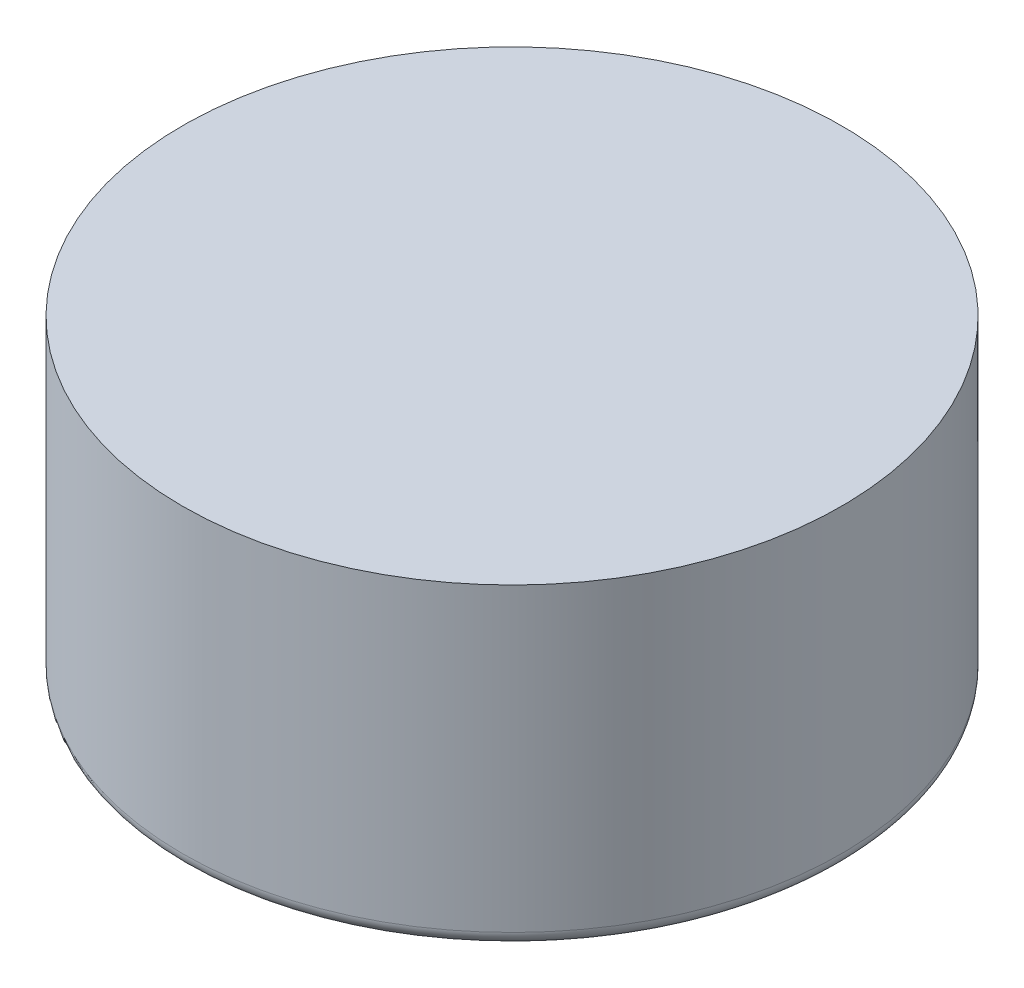
ISO-10303-21;
HEADER;
FILE_DESCRIPTION(('STEP AP214'),'2;1');
FILE_NAME('part.step','',(''),(''),'','','');
FILE_SCHEMA(('AUTOMOTIVE_DESIGN { 1 0 10303 214 1 1 1 1 }'));
ENDSEC;
DATA;
#1=APPLICATION_CONTEXT('core data for automotive mechanical design processes');
#2=APPLICATION_PROTOCOL_DEFINITION('international standard','automotive_design',2000,#1);
#3=PRODUCT_CONTEXT('',#1,'mechanical');
#4=PRODUCT('Part','Part','',(#3));
#5=PRODUCT_RELATED_PRODUCT_CATEGORY('part','',(#4));
#6=PRODUCT_DEFINITION_FORMATION('','',#4);
#7=PRODUCT_DEFINITION_CONTEXT('part definition',#1,'design');
#8=PRODUCT_DEFINITION('design','',#6,#7);
#9=PRODUCT_DEFINITION_SHAPE('','',#8);
#10=(LENGTH_UNIT() NAMED_UNIT(*) SI_UNIT(.MILLI.,.METRE.));
#11=(NAMED_UNIT(*) PLANE_ANGLE_UNIT() SI_UNIT($,.RADIAN.));
#12=(NAMED_UNIT(*) SI_UNIT($,.STERADIAN.) SOLID_ANGLE_UNIT());
#13=UNCERTAINTY_MEASURE_WITH_UNIT(LENGTH_MEASURE(1.E-05),#10,'distance_accuracy_value','');
#14=(GEOMETRIC_REPRESENTATION_CONTEXT(3) GLOBAL_UNCERTAINTY_ASSIGNED_CONTEXT((#13)) GLOBAL_UNIT_ASSIGNED_CONTEXT((#10,
#11,#12)) REPRESENTATION_CONTEXT('',''));
#15=CARTESIAN_POINT('',(0.,0.,0.));
#16=DIRECTION('',(0.,0.,1.));
#17=DIRECTION('',(1.,0.,0.));
#18=AXIS2_PLACEMENT_3D('',#15,#16,#17);
#19=CARTESIAN_POINT('',(0.,5.5,0.));
#20=DIRECTION('',(0.,-1.,0.));
#21=DIRECTION('',(0.,0.,-1.));
#22=AXIS2_PLACEMENT_3D('',#19,#20,#21);
#23=CYLINDRICAL_SURFACE('',#22,11.5);
#24=CARTESIAN_POINT('',(0.,-5.,0.));
#25=DIRECTION('',(0.,1.,0.));
#26=DIRECTION('',(0.,0.,1.));
#27=AXIS2_PLACEMENT_3D('',#24,#25,#26);
#28=CIRCLE('',#27,11.5);
#29=CARTESIAN_POINT('',(0.,-5.,11.5));
#30=VERTEX_POINT('',#29);
#31=EDGE_CURVE('E51',#30,#30,#28,.T.);
#32=ORIENTED_EDGE('',*,*,#31,.T.);
#33=EDGE_LOOP('',(#32));
#34=FACE_BOUND('',#33,.T.);
#35=CARTESIAN_POINT('',(0.,5.5,0.));
#36=DIRECTION('',(0.,1.,0.));
#37=DIRECTION('',(0.,0.,1.));
#38=AXIS2_PLACEMENT_3D('',#35,#36,#37);
#39=CIRCLE('',#38,11.5);
#40=CARTESIAN_POINT('',(0.,5.5,11.5));
#41=VERTEX_POINT('',#40);
#42=EDGE_CURVE('E61',#41,#41,#39,.T.);
#43=ORIENTED_EDGE('',*,*,#42,.F.);
#44=EDGE_LOOP('',(#43));
#45=FACE_BOUND('',#44,.T.);
#46=ADVANCED_FACE('F43',(#34,#45),#23,.T.);
#47=CARTESIAN_POINT('',(0.,5.5,0.));
#48=DIRECTION('',(0.,1.,0.));
#49=DIRECTION('',(0.,0.,1.));
#50=AXIS2_PLACEMENT_3D('',#47,#48,#49);
#51=PLANE('',#50);
#52=ORIENTED_EDGE('',*,*,#42,.T.);
#53=EDGE_LOOP('',(#52));
#54=FACE_BOUND('',#53,.T.);
#55=ADVANCED_FACE('F84',(#54),#51,.T.);
#56=CARTESIAN_POINT('',(0.,-5.5,0.));
#57=DIRECTION('',(0.,1.,0.));
#58=DIRECTION('',(0.,0.,1.));
#59=AXIS2_PLACEMENT_3D('',#56,#57,#58);
#60=PLANE('',#59);
#61=CARTESIAN_POINT('',(0.,-5.5,0.));
#62=DIRECTION('',(0.,1.,0.));
#63=DIRECTION('',(0.,0.,1.));
#64=AXIS2_PLACEMENT_3D('',#61,#62,#63);
#65=CIRCLE('',#64,11.);
#66=CARTESIAN_POINT('',(0.,-5.5,11.));
#67=VERTEX_POINT('',#66);
#68=EDGE_CURVE('E10',#67,#67,#65,.F.);
#69=ORIENTED_EDGE('',*,*,#68,.T.);
#70=EDGE_LOOP('',(#69));
#71=FACE_BOUND('',#70,.T.);
#72=CARTESIAN_POINT('',(0.,-5.5,0.));
#73=DIRECTION('',(0.,1.,0.));
#74=DIRECTION('',(0.,0.,1.));
#75=AXIS2_PLACEMENT_3D('',#72,#73,#74);
#76=CIRCLE('',#75,1.);
#77=CARTESIAN_POINT('',(0.,-5.5,1.));
#78=VERTEX_POINT('',#77);
#79=EDGE_CURVE('E57',#78,#78,#76,.F.);
#80=ORIENTED_EDGE('',*,*,#79,.F.);
#81=EDGE_LOOP('',(#80));
#82=FACE_BOUND('',#81,.T.);
#83=ADVANCED_FACE('F80',(#71,#82),#60,.F.);
#84=CARTESIAN_POINT('',(0.,-8.75,0.));
#85=DIRECTION('',(0.,1.,0.));
#86=DIRECTION('',(0.,0.,1.));
#87=AXIS2_PLACEMENT_3D('',#84,#85,#86);
#88=CYLINDRICAL_SURFACE('',#87,1.);
#89=CARTESIAN_POINT('',(0.,-8.75,0.));
#90=DIRECTION('',(0.,-1.,0.));
#91=DIRECTION('',(0.,0.,-1.));
#92=AXIS2_PLACEMENT_3D('',#89,#90,#91);
#93=CIRCLE('',#92,1.);
#94=CARTESIAN_POINT('',(0.,-8.75,1.));
#95=VERTEX_POINT('',#94);
#96=EDGE_CURVE('E69',#95,#95,#93,.T.);
#97=CARTESIAN_POINT('',(0.,-8.75,1.));
#98=CARTESIAN_POINT('',(0.,-8.71614583333333,1.));
#99=CARTESIAN_POINT('',(0.,-8.68229166666666,1.));
#100=CARTESIAN_POINT('',(0.,-8.61458333333333,1.));
#101=CARTESIAN_POINT('',(0.,-8.58072916666667,1.));
#102=CARTESIAN_POINT('',(0.,-8.51302083333333,1.));
#103=CARTESIAN_POINT('',(0.,-8.47916666666666,1.));
#104=CARTESIAN_POINT('',(0.,-8.41145833333333,1.));
#105=CARTESIAN_POINT('',(0.,-8.37760416666666,1.));
#106=CARTESIAN_POINT('',(0.,-8.30989583333333,1.));
#107=CARTESIAN_POINT('',(0.,-8.27604166666666,1.));
#108=CARTESIAN_POINT('',(0.,-8.20833333333333,1.));
#109=CARTESIAN_POINT('',(0.,-8.17447916666666,1.));
#110=CARTESIAN_POINT('',(0.,-8.10677083333333,1.));
#111=CARTESIAN_POINT('',(0.,-8.07291666666667,1.));
#112=CARTESIAN_POINT('',(0.,-8.00520833333333,1.));
#113=CARTESIAN_POINT('',(0.,-7.97135416666667,1.));
#114=CARTESIAN_POINT('',(0.,-7.90364583333333,1.));
#115=CARTESIAN_POINT('',(0.,-7.86979166666667,1.));
#116=CARTESIAN_POINT('',(0.,-7.80208333333333,1.));
#117=CARTESIAN_POINT('',(0.,-7.76822916666667,1.));
#118=CARTESIAN_POINT('',(0.,-7.70052083333333,1.));
#119=CARTESIAN_POINT('',(0.,-7.66666666666667,1.));
#120=CARTESIAN_POINT('',(0.,-7.59895833333333,1.));
#121=CARTESIAN_POINT('',(0.,-7.56510416666667,1.));
#122=CARTESIAN_POINT('',(0.,-7.49739583333333,1.));
#123=CARTESIAN_POINT('',(0.,-7.46354166666667,1.));
#124=CARTESIAN_POINT('',(0.,-7.39583333333333,1.));
#125=CARTESIAN_POINT('',(0.,-7.36197916666667,1.));
#126=CARTESIAN_POINT('',(0.,-7.29427083333333,1.));
#127=CARTESIAN_POINT('',(0.,-7.26041666666667,1.));
#128=CARTESIAN_POINT('',(0.,-7.19270833333333,1.));
#129=CARTESIAN_POINT('',(0.,-7.15885416666667,1.));
#130=CARTESIAN_POINT('',(0.,-7.09114583333333,1.));
#131=CARTESIAN_POINT('',(0.,-7.05729166666667,1.));
#132=CARTESIAN_POINT('',(0.,-6.98958333333333,1.));
#133=CARTESIAN_POINT('',(0.,-6.95572916666667,1.));
#134=CARTESIAN_POINT('',(0.,-6.88802083333333,1.));
#135=CARTESIAN_POINT('',(0.,-6.85416666666667,1.));
#136=CARTESIAN_POINT('',(0.,-6.78645833333333,1.));
#137=CARTESIAN_POINT('',(0.,-6.75260416666667,1.));
#138=CARTESIAN_POINT('',(0.,-6.68489583333333,1.));
#139=CARTESIAN_POINT('',(0.,-6.65104166666667,1.));
#140=CARTESIAN_POINT('',(0.,-6.58333333333333,1.));
#141=CARTESIAN_POINT('',(0.,-6.54947916666667,1.));
#142=CARTESIAN_POINT('',(0.,-6.48177083333333,1.));
#143=CARTESIAN_POINT('',(0.,-6.44791666666667,1.));
#144=CARTESIAN_POINT('',(0.,-6.38020833333333,1.));
#145=CARTESIAN_POINT('',(0.,-6.34635416666667,1.));
#146=CARTESIAN_POINT('',(0.,-6.27864583333333,1.));
#147=CARTESIAN_POINT('',(0.,-6.24479166666667,1.));
#148=CARTESIAN_POINT('',(0.,-6.17708333333333,1.));
#149=CARTESIAN_POINT('',(0.,-6.14322916666667,1.));
#150=CARTESIAN_POINT('',(0.,-6.07552083333333,1.));
#151=CARTESIAN_POINT('',(0.,-6.04166666666667,1.));
#152=CARTESIAN_POINT('',(0.,-5.97395833333333,1.));
#153=CARTESIAN_POINT('',(0.,-5.94010416666667,1.));
#154=CARTESIAN_POINT('',(0.,-5.87239583333333,1.));
#155=CARTESIAN_POINT('',(0.,-5.83854166666667,1.));
#156=CARTESIAN_POINT('',(0.,-5.77083333333333,1.));
#157=CARTESIAN_POINT('',(0.,-5.73697916666667,1.));
#158=CARTESIAN_POINT('',(0.,-5.66927083333333,1.));
#159=CARTESIAN_POINT('',(0.,-5.63541666666667,1.));
#160=CARTESIAN_POINT('',(0.,-5.56770833333333,1.));
#161=CARTESIAN_POINT('',(0.,-5.53385416666667,1.));
#162=CARTESIAN_POINT('',(0.,-5.5,1.));
#163=B_SPLINE_CURVE_WITH_KNOTS('',3,(#97,#98,#99,#100,#101,#102,#103,#104,#105,#106,#107,#108,
#109,#110,#111,#112,#113,#114,#115,#116,#117,#118,#119,#120,#121,#122,#123,#124,#125,#126,#127,
#128,#129,#130,#131,#132,#133,#134,#135,#136,#137,#138,#139,#140,#141,#142,#143,#144,#145,#146,
#147,#148,#149,#150,#151,#152,#153,#154,#155,#156,#157,#158,#159,#160,#161,#162),.UNSPECIFIED.,
.F.,.F.,(4,2,2,2,2,2,2,2,2,2,2,2,2,2,2,2,2,2,2,2,2,2,2,2,2,2,2,2,2,2,2,2,4),(0.,
0.101562500000001,0.203125,0.304687500000001,0.40625,0.507812500000001,0.609375000000001,
0.7109375,0.812500000000001,0.9140625,1.015625,1.1171875,1.21875,1.3203125,1.421875,1.5234375,
1.625,1.7265625,1.828125,1.9296875,2.03125,2.1328125,2.234375,2.3359375,2.4375,2.5390625,
2.640625,2.7421875,2.84375,2.9453125,3.046875,3.1484375,3.25),.UNSPECIFIED.);
#164=EDGE_CURVE('BSEAM74',#95,#78,#163,.T.);
#165=ORIENTED_EDGE('',*,*,#96,.F.);
#166=ORIENTED_EDGE('',*,*,#79,.T.);
#167=ORIENTED_EDGE('',*,*,#164,.T.);
#168=ORIENTED_EDGE('',*,*,#164,.F.);
#169=EDGE_LOOP('',(#165,#167,#166,#168));
#170=FACE_BOUND('',#169,.T.);
#171=ADVANCED_FACE('F74',(#170),#88,.T.);
#172=CARTESIAN_POINT('',(0.,-8.75,0.));
#173=DIRECTION('',(0.,-1.,0.));
#174=DIRECTION('',(0.,0.,-1.));
#175=AXIS2_PLACEMENT_3D('',#172,#173,#174);
#176=PLANE('',#175);
#177=ORIENTED_EDGE('',*,*,#96,.T.);
#178=EDGE_LOOP('',(#177));
#179=FACE_BOUND('',#178,.T.);
#180=ADVANCED_FACE('F75',(#179),#176,.T.);
#181=CARTESIAN_POINT('',(0.,-5.,0.));
#182=DIRECTION('',(0.,1.,0.));
#183=DIRECTION('',(0.,0.,1.));
#184=AXIS2_PLACEMENT_3D('',#181,#182,#183);
#185=TOROIDAL_SURFACE('',#184,11.,0.5);
#186=ORIENTED_EDGE('',*,*,#68,.F.);
#187=EDGE_LOOP('',(#186));
#188=FACE_BOUND('',#187,.T.);
#189=ORIENTED_EDGE('',*,*,#31,.F.);
#190=EDGE_LOOP('',(#189));
#191=FACE_BOUND('',#190,.T.);
#192=ADVANCED_FACE('F44',(#188,#191),#185,.T.);
#193=CLOSED_SHELL('',(#46,#55,#83,#171,#180,#192));
#194=MANIFOLD_SOLID_BREP('B2',#193);
#195=ADVANCED_BREP_SHAPE_REPRESENTATION('',(#18,#194),#14);
#196=SHAPE_DEFINITION_REPRESENTATION(#9,#195);
ENDSEC;
END-ISO-10303-21;
